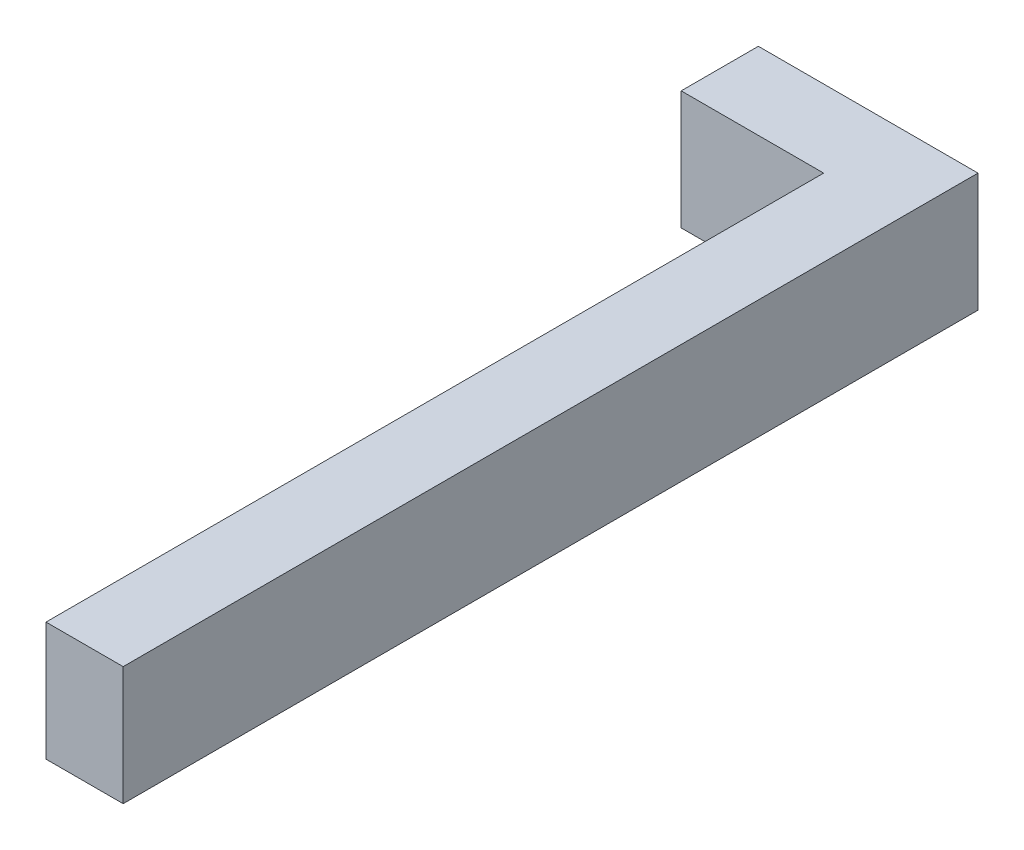
ISO-10303-21;
HEADER;
FILE_DESCRIPTION(('STEP AP214'),'2;1');
FILE_NAME('part.step','',(''),(''),'','','');
FILE_SCHEMA(('AUTOMOTIVE_DESIGN { 1 0 10303 214 1 1 1 1 }'));
ENDSEC;
DATA;
#1=APPLICATION_CONTEXT('core data for automotive mechanical design processes');
#2=APPLICATION_PROTOCOL_DEFINITION('international standard','automotive_design',2000,#1);
#3=PRODUCT_CONTEXT('',#1,'mechanical');
#4=PRODUCT('Part','Part','',(#3));
#5=PRODUCT_RELATED_PRODUCT_CATEGORY('part','',(#4));
#6=PRODUCT_DEFINITION_FORMATION('','',#4);
#7=PRODUCT_DEFINITION_CONTEXT('part definition',#1,'design');
#8=PRODUCT_DEFINITION('design','',#6,#7);
#9=PRODUCT_DEFINITION_SHAPE('','',#8);
#10=(LENGTH_UNIT() NAMED_UNIT(*) SI_UNIT(.MILLI.,.METRE.));
#11=(NAMED_UNIT(*) PLANE_ANGLE_UNIT() SI_UNIT($,.RADIAN.));
#12=(NAMED_UNIT(*) SI_UNIT($,.STERADIAN.) SOLID_ANGLE_UNIT());
#13=UNCERTAINTY_MEASURE_WITH_UNIT(LENGTH_MEASURE(1.E-05),#10,'distance_accuracy_value','');
#14=(GEOMETRIC_REPRESENTATION_CONTEXT(3) GLOBAL_UNCERTAINTY_ASSIGNED_CONTEXT((#13)) GLOBAL_UNIT_ASSIGNED_CONTEXT((#10,
#11,#12)) REPRESENTATION_CONTEXT('',''));
#15=CARTESIAN_POINT('',(0.,0.,0.));
#16=DIRECTION('',(0.,0.,1.));
#17=DIRECTION('',(1.,0.,0.));
#18=AXIS2_PLACEMENT_3D('',#15,#16,#17);
#19=CARTESIAN_POINT('',(0.,127.,0.));
#20=DIRECTION('',(1.,0.,0.));
#21=DIRECTION('',(0.,0.,-1.));
#22=AXIS2_PLACEMENT_3D('',#19,#20,#21);
#23=PLANE('',#22);
#24=DIRECTION('',(0.,0.,1.));
#25=VECTOR('',#24,1.);
#26=CARTESIAN_POINT('',(0.,0.,0.));
#27=LINE('',#26,#25);
#28=CARTESIAN_POINT('',(0.,0.,-82.55));
#29=VERTEX_POINT('',#28);
#30=CARTESIAN_POINT('',(0.,0.,0.));
#31=VERTEX_POINT('',#30);
#32=EDGE_CURVE('E117',#29,#31,#27,.T.);
#33=ORIENTED_EDGE('',*,*,#32,.T.);
#34=DIRECTION('',(0.,-1.,0.));
#35=VECTOR('',#34,1.);
#36=CARTESIAN_POINT('',(0.,127.,0.));
#37=LINE('',#36,#35);
#38=CARTESIAN_POINT('',(0.,127.,0.));
#39=VERTEX_POINT('',#38);
#40=EDGE_CURVE('E11',#39,#31,#37,.T.);
#41=ORIENTED_EDGE('',*,*,#40,.F.);
#42=DIRECTION('',(0.,0.,1.));
#43=VECTOR('',#42,1.);
#44=CARTESIAN_POINT('',(0.,127.,0.));
#45=LINE('',#44,#43);
#46=CARTESIAN_POINT('',(0.,127.,-82.55));
#47=VERTEX_POINT('',#46);
#48=EDGE_CURVE('E127',#47,#39,#45,.T.);
#49=ORIENTED_EDGE('',*,*,#48,.F.);
#50=DIRECTION('',(0.,-1.,0.));
#51=VECTOR('',#50,1.);
#52=CARTESIAN_POINT('',(0.,127.,-82.55));
#53=LINE('',#52,#51);
#54=EDGE_CURVE('E113',#47,#29,#53,.T.);
#55=ORIENTED_EDGE('',*,*,#54,.T.);
#56=EDGE_LOOP('',(#33,#41,#49,#55));
#57=FACE_BOUND('',#56,.T.);
#58=ADVANCED_FACE('F33',(#57),#23,.F.);
#59=CARTESIAN_POINT('',(0.,127.,0.));
#60=DIRECTION('',(0.,0.,-1.));
#61=DIRECTION('',(-1.,0.,0.));
#62=AXIS2_PLACEMENT_3D('',#59,#60,#61);
#63=PLANE('',#62);
#64=DIRECTION('',(1.,0.,0.));
#65=VECTOR('',#64,1.);
#66=CARTESIAN_POINT('',(0.,0.,0.));
#67=LINE('',#66,#65);
#68=CARTESIAN_POINT('',(152.4,0.,0.));
#69=VERTEX_POINT('',#68);
#70=EDGE_CURVE('E120',#31,#69,#67,.T.);
#71=ORIENTED_EDGE('',*,*,#70,.T.);
#72=DIRECTION('',(0.,-1.,0.));
#73=VECTOR('',#72,1.);
#74=CARTESIAN_POINT('',(152.4,127.,0.));
#75=LINE('',#74,#73);
#76=CARTESIAN_POINT('',(152.4,127.,0.));
#77=VERTEX_POINT('',#76);
#78=EDGE_CURVE('E41',#77,#69,#75,.T.);
#79=ORIENTED_EDGE('',*,*,#78,.F.);
#80=DIRECTION('',(1.,0.,0.));
#81=VECTOR('',#80,1.);
#82=CARTESIAN_POINT('',(0.,127.,0.));
#83=LINE('',#82,#81);
#84=EDGE_CURVE('E85',#39,#77,#83,.T.);
#85=ORIENTED_EDGE('',*,*,#84,.F.);
#86=ORIENTED_EDGE('',*,*,#40,.T.);
#87=EDGE_LOOP('',(#71,#79,#85,#86));
#88=FACE_BOUND('',#87,.T.);
#89=ADVANCED_FACE('F151',(#88),#63,.F.);
#90=CARTESIAN_POINT('',(152.4,127.,0.));
#91=DIRECTION('',(1.,0.,0.));
#92=DIRECTION('',(0.,0.,-1.));
#93=AXIS2_PLACEMENT_3D('',#90,#91,#92);
#94=PLANE('',#93);
#95=DIRECTION('',(0.,0.,1.));
#96=VECTOR('',#95,1.);
#97=CARTESIAN_POINT('',(152.4,0.,0.));
#98=LINE('',#97,#96);
#99=CARTESIAN_POINT('',(152.4,0.,831.85));
#100=VERTEX_POINT('',#99);
#101=EDGE_CURVE('E122',#69,#100,#98,.T.);
#102=ORIENTED_EDGE('',*,*,#101,.T.);
#103=DIRECTION('',(0.,-1.,0.));
#104=VECTOR('',#103,1.);
#105=CARTESIAN_POINT('',(152.4,127.,831.85));
#106=LINE('',#105,#104);
#107=CARTESIAN_POINT('',(152.4,127.,831.85));
#108=VERTEX_POINT('',#107);
#109=EDGE_CURVE('E108',#108,#100,#106,.T.);
#110=ORIENTED_EDGE('',*,*,#109,.F.);
#111=DIRECTION('',(0.,0.,1.));
#112=VECTOR('',#111,1.);
#113=CARTESIAN_POINT('',(152.4,127.,0.));
#114=LINE('',#113,#112);
#115=EDGE_CURVE('E98',#77,#108,#114,.T.);
#116=ORIENTED_EDGE('',*,*,#115,.F.);
#117=ORIENTED_EDGE('',*,*,#78,.T.);
#118=EDGE_LOOP('',(#102,#110,#116,#117));
#119=FACE_BOUND('',#118,.T.);
#120=ADVANCED_FACE('F133',(#119),#94,.F.);
#121=CARTESIAN_POINT('',(234.95,127.,831.85));
#122=DIRECTION('',(0.,0.,-1.));
#123=DIRECTION('',(-1.,0.,0.));
#124=AXIS2_PLACEMENT_3D('',#121,#122,#123);
#125=PLANE('',#124);
#126=DIRECTION('',(1.,0.,0.));
#127=VECTOR('',#126,1.);
#128=CARTESIAN_POINT('',(234.95,0.,831.85));
#129=LINE('',#128,#127);
#130=CARTESIAN_POINT('',(234.95,0.,831.85));
#131=VERTEX_POINT('',#130);
#132=EDGE_CURVE('E107',#100,#131,#129,.T.);
#133=ORIENTED_EDGE('',*,*,#132,.T.);
#134=DIRECTION('',(0.,-1.,0.));
#135=VECTOR('',#134,1.);
#136=CARTESIAN_POINT('',(234.95,127.,831.85));
#137=LINE('',#136,#135);
#138=CARTESIAN_POINT('',(234.95,127.,831.85));
#139=VERTEX_POINT('',#138);
#140=EDGE_CURVE('E104',#139,#131,#137,.T.);
#141=ORIENTED_EDGE('',*,*,#140,.F.);
#142=DIRECTION('',(1.,0.,0.));
#143=VECTOR('',#142,1.);
#144=CARTESIAN_POINT('',(234.95,127.,831.85));
#145=LINE('',#144,#143);
#146=EDGE_CURVE('E92',#108,#139,#145,.T.);
#147=ORIENTED_EDGE('',*,*,#146,.F.);
#148=ORIENTED_EDGE('',*,*,#109,.T.);
#149=EDGE_LOOP('',(#133,#141,#147,#148));
#150=FACE_BOUND('',#149,.T.);
#151=ADVANCED_FACE('F105',(#150),#125,.F.);
#152=CARTESIAN_POINT('',(234.95,127.,0.));
#153=DIRECTION('',(-1.,0.,0.));
#154=DIRECTION('',(0.,0.,1.));
#155=AXIS2_PLACEMENT_3D('',#152,#153,#154);
#156=PLANE('',#155);
#157=DIRECTION('',(0.,0.,-1.));
#158=VECTOR('',#157,1.);
#159=CARTESIAN_POINT('',(234.95,0.,0.));
#160=LINE('',#159,#158);
#161=CARTESIAN_POINT('',(234.95,0.,-82.55));
#162=VERTEX_POINT('',#161);
#163=EDGE_CURVE('E71',#131,#162,#160,.T.);
#164=ORIENTED_EDGE('',*,*,#163,.T.);
#165=DIRECTION('',(0.,-1.,0.));
#166=VECTOR('',#165,1.);
#167=CARTESIAN_POINT('',(234.95,127.,-82.55));
#168=LINE('',#167,#166);
#169=CARTESIAN_POINT('',(234.95,127.,-82.55));
#170=VERTEX_POINT('',#169);
#171=EDGE_CURVE('E109',#170,#162,#168,.T.);
#172=ORIENTED_EDGE('',*,*,#171,.F.);
#173=DIRECTION('',(0.,0.,-1.));
#174=VECTOR('',#173,1.);
#175=CARTESIAN_POINT('',(234.95,127.,0.));
#176=LINE('',#175,#174);
#177=EDGE_CURVE('E96',#139,#170,#176,.T.);
#178=ORIENTED_EDGE('',*,*,#177,.F.);
#179=ORIENTED_EDGE('',*,*,#140,.T.);
#180=EDGE_LOOP('',(#164,#172,#178,#179));
#181=FACE_BOUND('',#180,.T.);
#182=ADVANCED_FACE('F111',(#181),#156,.F.);
#183=CARTESIAN_POINT('',(0.,127.,-82.55));
#184=DIRECTION('',(0.,0.,1.));
#185=DIRECTION('',(1.,0.,0.));
#186=AXIS2_PLACEMENT_3D('',#183,#184,#185);
#187=PLANE('',#186);
#188=DIRECTION('',(-1.,0.,0.));
#189=VECTOR('',#188,1.);
#190=CARTESIAN_POINT('',(0.,0.,-82.55));
#191=LINE('',#190,#189);
#192=EDGE_CURVE('E77',#162,#29,#191,.T.);
#193=ORIENTED_EDGE('',*,*,#192,.T.);
#194=ORIENTED_EDGE('',*,*,#54,.F.);
#195=DIRECTION('',(-1.,0.,0.));
#196=VECTOR('',#195,1.);
#197=CARTESIAN_POINT('',(0.,127.,-82.55));
#198=LINE('',#197,#196);
#199=EDGE_CURVE('E49',#170,#47,#198,.T.);
#200=ORIENTED_EDGE('',*,*,#199,.F.);
#201=ORIENTED_EDGE('',*,*,#171,.T.);
#202=EDGE_LOOP('',(#193,#194,#200,#201));
#203=FACE_BOUND('',#202,.T.);
#204=ADVANCED_FACE('F140',(#203),#187,.F.);
#205=CARTESIAN_POINT('',(0.,127.,0.));
#206=DIRECTION('',(0.,-1.,0.));
#207=DIRECTION('',(0.,0.,-1.));
#208=AXIS2_PLACEMENT_3D('',#205,#206,#207);
#209=PLANE('',#208);
#210=ORIENTED_EDGE('',*,*,#48,.T.);
#211=ORIENTED_EDGE('',*,*,#84,.T.);
#212=ORIENTED_EDGE('',*,*,#115,.T.);
#213=ORIENTED_EDGE('',*,*,#146,.T.);
#214=ORIENTED_EDGE('',*,*,#177,.T.);
#215=ORIENTED_EDGE('',*,*,#199,.T.);
#216=EDGE_LOOP('',(#210,#211,#212,#213,#214,#215));
#217=FACE_BOUND('',#216,.T.);
#218=ADVANCED_FACE('F94',(#217),#209,.F.);
#219=CARTESIAN_POINT('',(0.,0.,0.));
#220=DIRECTION('',(0.,-1.,0.));
#221=DIRECTION('',(0.,0.,-1.));
#222=AXIS2_PLACEMENT_3D('',#219,#220,#221);
#223=PLANE('',#222);
#224=ORIENTED_EDGE('',*,*,#32,.F.);
#225=ORIENTED_EDGE('',*,*,#192,.F.);
#226=ORIENTED_EDGE('',*,*,#163,.F.);
#227=ORIENTED_EDGE('',*,*,#132,.F.);
#228=ORIENTED_EDGE('',*,*,#101,.F.);
#229=ORIENTED_EDGE('',*,*,#70,.F.);
#230=EDGE_LOOP('',(#224,#225,#226,#227,#228,#229));
#231=FACE_BOUND('',#230,.T.);
#232=ADVANCED_FACE('F136',(#231),#223,.T.);
#233=CLOSED_SHELL('',(#58,#89,#120,#151,#182,#204,#218,#232));
#234=MANIFOLD_SOLID_BREP('B2',#233);
#235=ADVANCED_BREP_SHAPE_REPRESENTATION('',(#18,#234),#14);
#236=SHAPE_DEFINITION_REPRESENTATION(#9,#235);
ENDSEC;
END-ISO-10303-21;
